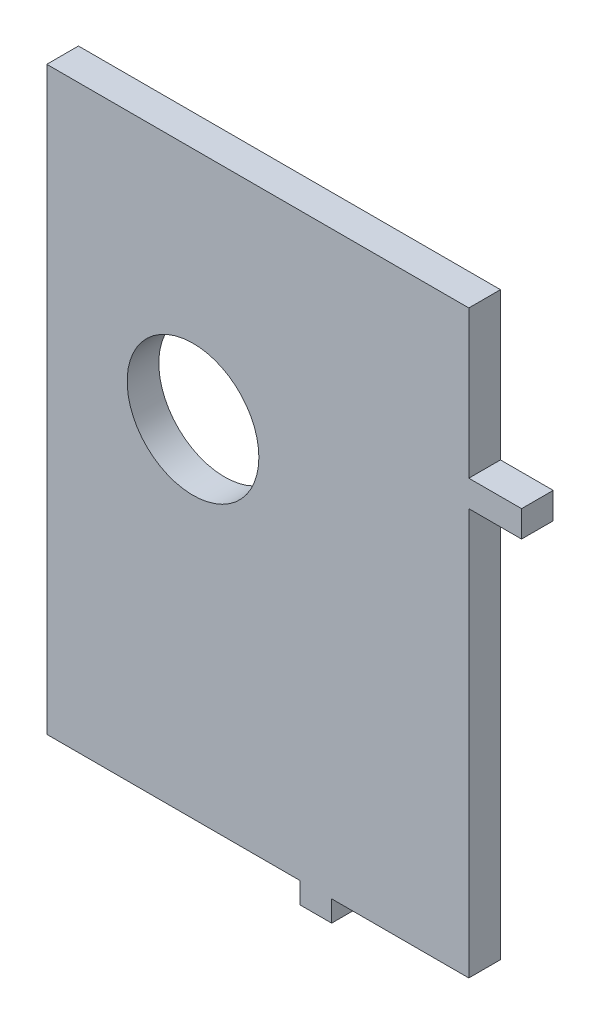
ISO-10303-21;
HEADER;
FILE_DESCRIPTION(('STEP AP214'),'2;1');
FILE_NAME('part.step','',(''),(''),'','','');
FILE_SCHEMA(('AUTOMOTIVE_DESIGN { 1 0 10303 214 1 1 1 1 }'));
ENDSEC;
DATA;
#1=APPLICATION_CONTEXT('core data for automotive mechanical design processes');
#2=APPLICATION_PROTOCOL_DEFINITION('international standard','automotive_design',2000,#1);
#3=PRODUCT_CONTEXT('',#1,'mechanical');
#4=PRODUCT('Part','Part','',(#3));
#5=PRODUCT_RELATED_PRODUCT_CATEGORY('part','',(#4));
#6=PRODUCT_DEFINITION_FORMATION('','',#4);
#7=PRODUCT_DEFINITION_CONTEXT('part definition',#1,'design');
#8=PRODUCT_DEFINITION('design','',#6,#7);
#9=PRODUCT_DEFINITION_SHAPE('','',#8);
#10=(LENGTH_UNIT() NAMED_UNIT(*) SI_UNIT(.MILLI.,.METRE.));
#11=(NAMED_UNIT(*) PLANE_ANGLE_UNIT() SI_UNIT($,.RADIAN.));
#12=(NAMED_UNIT(*) SI_UNIT($,.STERADIAN.) SOLID_ANGLE_UNIT());
#13=UNCERTAINTY_MEASURE_WITH_UNIT(LENGTH_MEASURE(1.E-05),#10,'distance_accuracy_value','');
#14=(GEOMETRIC_REPRESENTATION_CONTEXT(3) GLOBAL_UNCERTAINTY_ASSIGNED_CONTEXT((#13)) GLOBAL_UNIT_ASSIGNED_CONTEXT((#10,
#11,#12)) REPRESENTATION_CONTEXT('',''));
#15=CARTESIAN_POINT('',(0.,0.,0.));
#16=DIRECTION('',(0.,0.,1.));
#17=DIRECTION('',(1.,0.,0.));
#18=AXIS2_PLACEMENT_3D('',#15,#16,#17);
#19=CARTESIAN_POINT('',(80.,0.,6.));
#20=DIRECTION('',(-1.,0.,0.));
#21=DIRECTION('',(0.,-1.,0.));
#22=AXIS2_PLACEMENT_3D('',#19,#20,#21);
#23=PLANE('',#22);
#24=DIRECTION('',(0.,0.,1.));
#25=VECTOR('',#24,1.);
#26=CARTESIAN_POINT('',(80.,82.05,0.));
#27=LINE('',#26,#25);
#28=CARTESIAN_POINT('',(80.,82.05,0.));
#29=VERTEX_POINT('',#28);
#30=CARTESIAN_POINT('',(80.,82.05,6.));
#31=VERTEX_POINT('',#30);
#32=EDGE_CURVE('E263',#29,#31,#27,.T.);
#33=ORIENTED_EDGE('',*,*,#32,.F.);
#34=DIRECTION('',(0.,1.,0.));
#35=VECTOR('',#34,1.);
#36=CARTESIAN_POINT('',(80.,0.,0.));
#37=LINE('',#36,#35);
#38=CARTESIAN_POINT('',(80.,110.,0.));
#39=VERTEX_POINT('',#38);
#40=EDGE_CURVE('E149',#29,#39,#37,.T.);
#41=ORIENTED_EDGE('',*,*,#40,.T.);
#42=DIRECTION('',(0.,0.,-1.));
#43=VECTOR('',#42,1.);
#44=CARTESIAN_POINT('',(80.,110.,6.));
#45=LINE('',#44,#43);
#46=CARTESIAN_POINT('',(80.,110.,6.));
#47=VERTEX_POINT('',#46);
#48=EDGE_CURVE('E169',#47,#39,#45,.T.);
#49=ORIENTED_EDGE('',*,*,#48,.F.);
#50=DIRECTION('',(0.,1.,0.));
#51=VECTOR('',#50,1.);
#52=CARTESIAN_POINT('',(80.,0.,6.));
#53=LINE('',#52,#51);
#54=EDGE_CURVE('E183',#31,#47,#53,.T.);
#55=ORIENTED_EDGE('',*,*,#54,.F.);
#56=EDGE_LOOP('',(#33,#41,#49,#55));
#57=FACE_BOUND('',#56,.T.);
#58=ADVANCED_FACE('F33',(#57),#23,.F.);
#59=CARTESIAN_POINT('',(0.,0.,6.));
#60=DIRECTION('',(0.,1.,0.));
#61=DIRECTION('',(0.,0.,1.));
#62=AXIS2_PLACEMENT_3D('',#59,#60,#61);
#63=PLANE('',#62);
#64=DIRECTION('',(0.,0.,1.));
#65=VECTOR('',#64,1.);
#66=CARTESIAN_POINT('',(54.,0.,0.));
#67=LINE('',#66,#65);
#68=CARTESIAN_POINT('',(54.,0.,0.));
#69=VERTEX_POINT('',#68);
#70=CARTESIAN_POINT('',(54.,0.,6.));
#71=VERTEX_POINT('',#70);
#72=EDGE_CURVE('E225',#69,#71,#67,.T.);
#73=ORIENTED_EDGE('',*,*,#72,.F.);
#74=DIRECTION('',(1.,0.,0.));
#75=VECTOR('',#74,1.);
#76=CARTESIAN_POINT('',(0.,0.,0.));
#77=LINE('',#76,#75);
#78=CARTESIAN_POINT('',(80.,0.,0.));
#79=VERTEX_POINT('',#78);
#80=EDGE_CURVE('E176',#69,#79,#77,.T.);
#81=ORIENTED_EDGE('',*,*,#80,.T.);
#82=DIRECTION('',(0.,0.,-1.));
#83=VECTOR('',#82,1.);
#84=CARTESIAN_POINT('',(80.,0.,6.));
#85=LINE('',#84,#83);
#86=CARTESIAN_POINT('',(80.,0.,6.));
#87=VERTEX_POINT('',#86);
#88=EDGE_CURVE('E42',#87,#79,#85,.T.);
#89=ORIENTED_EDGE('',*,*,#88,.F.);
#90=DIRECTION('',(1.,0.,0.));
#91=VECTOR('',#90,1.);
#92=CARTESIAN_POINT('',(0.,0.,6.));
#93=LINE('',#92,#91);
#94=EDGE_CURVE('E184',#71,#87,#93,.T.);
#95=ORIENTED_EDGE('',*,*,#94,.F.);
#96=EDGE_LOOP('',(#73,#81,#89,#95));
#97=FACE_BOUND('',#96,.T.);
#98=ADVANCED_FACE('F224',(#97),#63,.F.);
#99=CARTESIAN_POINT('',(0.,0.,6.));
#100=DIRECTION('',(1.,0.,0.));
#101=DIRECTION('',(0.,0.,-1.));
#102=AXIS2_PLACEMENT_3D('',#99,#100,#101);
#103=PLANE('',#102);
#104=DIRECTION('',(0.,-1.,0.));
#105=VECTOR('',#104,1.);
#106=CARTESIAN_POINT('',(0.,0.,0.));
#107=LINE('',#106,#105);
#108=CARTESIAN_POINT('',(0.,110.,0.));
#109=VERTEX_POINT('',#108);
#110=CARTESIAN_POINT('',(0.,0.,0.));
#111=VERTEX_POINT('',#110);
#112=EDGE_CURVE('E178',#109,#111,#107,.T.);
#113=ORIENTED_EDGE('',*,*,#112,.T.);
#114=DIRECTION('',(0.,0.,-1.));
#115=VECTOR('',#114,1.);
#116=CARTESIAN_POINT('',(0.,0.,6.));
#117=LINE('',#116,#115);
#118=CARTESIAN_POINT('',(0.,0.,6.));
#119=VERTEX_POINT('',#118);
#120=EDGE_CURVE('E11',#119,#111,#117,.T.);
#121=ORIENTED_EDGE('',*,*,#120,.F.);
#122=DIRECTION('',(0.,-1.,0.));
#123=VECTOR('',#122,1.);
#124=CARTESIAN_POINT('',(0.,0.,6.));
#125=LINE('',#124,#123);
#126=CARTESIAN_POINT('',(0.,110.,6.));
#127=VERTEX_POINT('',#126);
#128=EDGE_CURVE('E151',#127,#119,#125,.T.);
#129=ORIENTED_EDGE('',*,*,#128,.F.);
#130=DIRECTION('',(0.,0.,-1.));
#131=VECTOR('',#130,1.);
#132=CARTESIAN_POINT('',(0.,110.,6.));
#133=LINE('',#132,#131);
#134=EDGE_CURVE('E166',#127,#109,#133,.T.);
#135=ORIENTED_EDGE('',*,*,#134,.T.);
#136=EDGE_LOOP('',(#113,#121,#129,#135));
#137=FACE_BOUND('',#136,.T.);
#138=ADVANCED_FACE('F35',(#137),#103,.F.);
#139=CARTESIAN_POINT('',(48.,0.,0.));
#140=VERTEX_POINT('',#139);
#141=EDGE_CURVE('E153',#111,#140,#77,.T.);
#142=ORIENTED_EDGE('',*,*,#141,.T.);
#143=DIRECTION('',(0.,0.,1.));
#144=VECTOR('',#143,1.);
#145=CARTESIAN_POINT('',(48.,0.,0.));
#146=LINE('',#145,#144);
#147=CARTESIAN_POINT('',(48.,0.,6.));
#148=VERTEX_POINT('',#147);
#149=EDGE_CURVE('E254',#140,#148,#146,.T.);
#150=ORIENTED_EDGE('',*,*,#149,.T.);
#151=EDGE_CURVE('E179',#119,#148,#93,.T.);
#152=ORIENTED_EDGE('',*,*,#151,.F.);
#153=ORIENTED_EDGE('',*,*,#120,.T.);
#154=EDGE_LOOP('',(#142,#150,#152,#153));
#155=FACE_BOUND('',#154,.T.);
#156=ADVANCED_FACE('F292',(#155),#63,.F.);
#157=CARTESIAN_POINT('',(80.,77.05,0.));
#158=VERTEX_POINT('',#157);
#159=EDGE_CURVE('E139',#79,#158,#37,.T.);
#160=ORIENTED_EDGE('',*,*,#159,.T.);
#161=DIRECTION('',(0.,0.,1.));
#162=VECTOR('',#161,1.);
#163=CARTESIAN_POINT('',(80.,77.05,0.));
#164=LINE('',#163,#162);
#165=CARTESIAN_POINT('',(80.,77.05,6.));
#166=VERTEX_POINT('',#165);
#167=EDGE_CURVE('E122',#158,#166,#164,.T.);
#168=ORIENTED_EDGE('',*,*,#167,.T.);
#169=EDGE_CURVE('E196',#87,#166,#53,.T.);
#170=ORIENTED_EDGE('',*,*,#169,.F.);
#171=ORIENTED_EDGE('',*,*,#88,.T.);
#172=EDGE_LOOP('',(#160,#168,#170,#171));
#173=FACE_BOUND('',#172,.T.);
#174=ADVANCED_FACE('F146',(#173),#23,.F.);
#175=CARTESIAN_POINT('',(0.,110.,6.));
#176=DIRECTION('',(0.,-1.,0.));
#177=DIRECTION('',(0.,0.,-1.));
#178=AXIS2_PLACEMENT_3D('',#175,#176,#177);
#179=PLANE('',#178);
#180=DIRECTION('',(-1.,0.,0.));
#181=VECTOR('',#180,1.);
#182=CARTESIAN_POINT('',(0.,110.,0.));
#183=LINE('',#182,#181);
#184=EDGE_CURVE('E148',#39,#109,#183,.T.);
#185=ORIENTED_EDGE('',*,*,#184,.T.);
#186=ORIENTED_EDGE('',*,*,#134,.F.);
#187=DIRECTION('',(-1.,0.,0.));
#188=VECTOR('',#187,1.);
#189=CARTESIAN_POINT('',(0.,110.,6.));
#190=LINE('',#189,#188);
#191=EDGE_CURVE('E170',#47,#127,#190,.T.);
#192=ORIENTED_EDGE('',*,*,#191,.F.);
#193=ORIENTED_EDGE('',*,*,#48,.T.);
#194=EDGE_LOOP('',(#185,#186,#192,#193));
#195=FACE_BOUND('',#194,.T.);
#196=ADVANCED_FACE('F212',(#195),#179,.F.);
#197=CARTESIAN_POINT('',(0.,0.,6.));
#198=DIRECTION('',(0.,0.,-1.));
#199=DIRECTION('',(-1.,0.,0.));
#200=AXIS2_PLACEMENT_3D('',#197,#198,#199);
#201=PLANE('',#200);
#202=CARTESIAN_POINT('',(27.72,65.58,6.));
#203=DIRECTION('',(0.,0.,1.));
#204=DIRECTION('',(1.,0.,0.));
#205=AXIS2_PLACEMENT_3D('',#202,#203,#204);
#206=CIRCLE('',#205,12.4841);
#207=CARTESIAN_POINT('',(40.2041,65.58,6.));
#208=VERTEX_POINT('',#207);
#209=EDGE_CURVE('E282',#208,#208,#206,.T.);
#210=ORIENTED_EDGE('',*,*,#209,.F.);
#211=EDGE_LOOP('',(#210));
#212=FACE_BOUND('',#211,.T.);
#213=ORIENTED_EDGE('',*,*,#128,.T.);
#214=ORIENTED_EDGE('',*,*,#151,.T.);
#215=DIRECTION('',(0.,-1.,0.));
#216=VECTOR('',#215,1.);
#217=CARTESIAN_POINT('',(48.,0.,6.));
#218=LINE('',#217,#216);
#219=CARTESIAN_POINT('',(48.,-4.,6.));
#220=VERTEX_POINT('',#219);
#221=EDGE_CURVE('E58',#148,#220,#218,.T.);
#222=ORIENTED_EDGE('',*,*,#221,.T.);
#223=DIRECTION('',(1.,0.,0.));
#224=VECTOR('',#223,1.);
#225=CARTESIAN_POINT('',(48.,-4.,6.));
#226=LINE('',#225,#224);
#227=CARTESIAN_POINT('',(54.,-4.,6.));
#228=VERTEX_POINT('',#227);
#229=EDGE_CURVE('E247',#220,#228,#226,.T.);
#230=ORIENTED_EDGE('',*,*,#229,.T.);
#231=DIRECTION('',(0.,1.,0.));
#232=VECTOR('',#231,1.);
#233=CARTESIAN_POINT('',(54.,0.,6.));
#234=LINE('',#233,#232);
#235=EDGE_CURVE('E221',#228,#71,#234,.T.);
#236=ORIENTED_EDGE('',*,*,#235,.T.);
#237=ORIENTED_EDGE('',*,*,#94,.T.);
#238=ORIENTED_EDGE('',*,*,#169,.T.);
#239=DIRECTION('',(1.,0.,0.));
#240=VECTOR('',#239,1.);
#241=CARTESIAN_POINT('',(80.,77.05,6.));
#242=LINE('',#241,#240);
#243=CARTESIAN_POINT('',(90.,77.05,6.));
#244=VERTEX_POINT('',#243);
#245=EDGE_CURVE('E50',#166,#244,#242,.T.);
#246=ORIENTED_EDGE('',*,*,#245,.T.);
#247=DIRECTION('',(0.,1.,0.));
#248=VECTOR('',#247,1.);
#249=CARTESIAN_POINT('',(90.,82.05,6.));
#250=LINE('',#249,#248);
#251=CARTESIAN_POINT('',(90.,82.05,6.));
#252=VERTEX_POINT('',#251);
#253=EDGE_CURVE('E275',#244,#252,#250,.T.);
#254=ORIENTED_EDGE('',*,*,#253,.T.);
#255=DIRECTION('',(-1.,0.,0.));
#256=VECTOR('',#255,1.);
#257=CARTESIAN_POINT('',(80.,82.05,6.));
#258=LINE('',#257,#256);
#259=EDGE_CURVE('E143',#252,#31,#258,.T.);
#260=ORIENTED_EDGE('',*,*,#259,.T.);
#261=ORIENTED_EDGE('',*,*,#54,.T.);
#262=ORIENTED_EDGE('',*,*,#191,.T.);
#263=EDGE_LOOP('',(#213,#214,#222,#230,#236,#237,#238,#246,#254,#260,#261,#262));
#264=FACE_BOUND('',#263,.T.);
#265=ADVANCED_FACE('F202',(#212,#264),#201,.F.);
#266=CARTESIAN_POINT('',(0.,0.,0.));
#267=DIRECTION('',(0.,0.,-1.));
#268=DIRECTION('',(-1.,0.,0.));
#269=AXIS2_PLACEMENT_3D('',#266,#267,#268);
#270=PLANE('',#269);
#271=CARTESIAN_POINT('',(27.72,65.58,0.));
#272=DIRECTION('',(0.,0.,1.));
#273=DIRECTION('',(1.,0.,0.));
#274=AXIS2_PLACEMENT_3D('',#271,#272,#273);
#275=CIRCLE('',#274,12.4841);
#276=CARTESIAN_POINT('',(40.2041,65.58,0.));
#277=VERTEX_POINT('',#276);
#278=EDGE_CURVE('E280',#277,#277,#275,.T.);
#279=ORIENTED_EDGE('',*,*,#278,.T.);
#280=EDGE_LOOP('',(#279));
#281=FACE_BOUND('',#280,.T.);
#282=ORIENTED_EDGE('',*,*,#112,.F.);
#283=ORIENTED_EDGE('',*,*,#184,.F.);
#284=ORIENTED_EDGE('',*,*,#40,.F.);
#285=DIRECTION('',(-1.,0.,0.));
#286=VECTOR('',#285,1.);
#287=CARTESIAN_POINT('',(80.,82.05,0.));
#288=LINE('',#287,#286);
#289=CARTESIAN_POINT('',(90.,82.05,0.));
#290=VERTEX_POINT('',#289);
#291=EDGE_CURVE('E131',#290,#29,#288,.T.);
#292=ORIENTED_EDGE('',*,*,#291,.F.);
#293=DIRECTION('',(0.,1.,0.));
#294=VECTOR('',#293,1.);
#295=CARTESIAN_POINT('',(90.,82.05,0.));
#296=LINE('',#295,#294);
#297=CARTESIAN_POINT('',(90.,77.05,0.));
#298=VERTEX_POINT('',#297);
#299=EDGE_CURVE('E142',#298,#290,#296,.T.);
#300=ORIENTED_EDGE('',*,*,#299,.F.);
#301=DIRECTION('',(1.,0.,0.));
#302=VECTOR('',#301,1.);
#303=CARTESIAN_POINT('',(80.,77.05,0.));
#304=LINE('',#303,#302);
#305=EDGE_CURVE('E125',#158,#298,#304,.T.);
#306=ORIENTED_EDGE('',*,*,#305,.F.);
#307=ORIENTED_EDGE('',*,*,#159,.F.);
#308=ORIENTED_EDGE('',*,*,#80,.F.);
#309=DIRECTION('',(0.,1.,0.));
#310=VECTOR('',#309,1.);
#311=CARTESIAN_POINT('',(54.,0.,0.));
#312=LINE('',#311,#310);
#313=CARTESIAN_POINT('',(54.,-4.,0.));
#314=VERTEX_POINT('',#313);
#315=EDGE_CURVE('E228',#314,#69,#312,.T.);
#316=ORIENTED_EDGE('',*,*,#315,.F.);
#317=DIRECTION('',(1.,0.,0.));
#318=VECTOR('',#317,1.);
#319=CARTESIAN_POINT('',(48.,-4.,0.));
#320=LINE('',#319,#318);
#321=CARTESIAN_POINT('',(48.,-4.,0.));
#322=VERTEX_POINT('',#321);
#323=EDGE_CURVE('E231',#322,#314,#320,.T.);
#324=ORIENTED_EDGE('',*,*,#323,.F.);
#325=DIRECTION('',(0.,-1.,0.));
#326=VECTOR('',#325,1.);
#327=CARTESIAN_POINT('',(48.,0.,0.));
#328=LINE('',#327,#326);
#329=EDGE_CURVE('E240',#140,#322,#328,.T.);
#330=ORIENTED_EDGE('',*,*,#329,.F.);
#331=ORIENTED_EDGE('',*,*,#141,.F.);
#332=EDGE_LOOP('',(#282,#283,#284,#292,#300,#306,#307,#308,#316,#324,#330,#331));
#333=FACE_BOUND('',#332,.T.);
#334=ADVANCED_FACE('F137',(#281,#333),#270,.T.);
#335=CARTESIAN_POINT('',(48.,0.,0.));
#336=DIRECTION('',(-1.,0.,0.));
#337=DIRECTION('',(0.,0.,1.));
#338=AXIS2_PLACEMENT_3D('',#335,#336,#337);
#339=PLANE('',#338);
#340=ORIENTED_EDGE('',*,*,#221,.F.);
#341=ORIENTED_EDGE('',*,*,#149,.F.);
#342=ORIENTED_EDGE('',*,*,#329,.T.);
#343=DIRECTION('',(0.,0.,1.));
#344=VECTOR('',#343,1.);
#345=CARTESIAN_POINT('',(48.,-4.,0.));
#346=LINE('',#345,#344);
#347=EDGE_CURVE('E234',#322,#220,#346,.T.);
#348=ORIENTED_EDGE('',*,*,#347,.T.);
#349=EDGE_LOOP('',(#340,#341,#342,#348));
#350=FACE_BOUND('',#349,.T.);
#351=ADVANCED_FACE('F262',(#350),#339,.T.);
#352=CARTESIAN_POINT('',(54.,0.,0.));
#353=DIRECTION('',(1.,0.,0.));
#354=DIRECTION('',(0.,0.,-1.));
#355=AXIS2_PLACEMENT_3D('',#352,#353,#354);
#356=PLANE('',#355);
#357=ORIENTED_EDGE('',*,*,#235,.F.);
#358=DIRECTION('',(0.,0.,1.));
#359=VECTOR('',#358,1.);
#360=CARTESIAN_POINT('',(54.,-4.,0.));
#361=LINE('',#360,#359);
#362=EDGE_CURVE('E239',#314,#228,#361,.T.);
#363=ORIENTED_EDGE('',*,*,#362,.F.);
#364=ORIENTED_EDGE('',*,*,#315,.T.);
#365=ORIENTED_EDGE('',*,*,#72,.T.);
#366=EDGE_LOOP('',(#357,#363,#364,#365));
#367=FACE_BOUND('',#366,.T.);
#368=ADVANCED_FACE('F313',(#367),#356,.T.);
#369=CARTESIAN_POINT('',(48.,-4.,0.));
#370=DIRECTION('',(0.,-1.,0.));
#371=DIRECTION('',(0.,0.,-1.));
#372=AXIS2_PLACEMENT_3D('',#369,#370,#371);
#373=PLANE('',#372);
#374=ORIENTED_EDGE('',*,*,#229,.F.);
#375=ORIENTED_EDGE('',*,*,#347,.F.);
#376=ORIENTED_EDGE('',*,*,#323,.T.);
#377=ORIENTED_EDGE('',*,*,#362,.T.);
#378=EDGE_LOOP('',(#374,#375,#376,#377));
#379=FACE_BOUND('',#378,.T.);
#380=ADVANCED_FACE('F238',(#379),#373,.T.);
#381=CARTESIAN_POINT('',(80.,82.05,0.));
#382=DIRECTION('',(0.,1.,0.));
#383=DIRECTION('',(0.,0.,1.));
#384=AXIS2_PLACEMENT_3D('',#381,#382,#383);
#385=PLANE('',#384);
#386=ORIENTED_EDGE('',*,*,#259,.F.);
#387=DIRECTION('',(0.,0.,1.));
#388=VECTOR('',#387,1.);
#389=CARTESIAN_POINT('',(90.,82.05,0.));
#390=LINE('',#389,#388);
#391=EDGE_CURVE('E264',#290,#252,#390,.T.);
#392=ORIENTED_EDGE('',*,*,#391,.F.);
#393=ORIENTED_EDGE('',*,*,#291,.T.);
#394=ORIENTED_EDGE('',*,*,#32,.T.);
#395=EDGE_LOOP('',(#386,#392,#393,#394));
#396=FACE_BOUND('',#395,.T.);
#397=ADVANCED_FACE('F290',(#396),#385,.T.);
#398=CARTESIAN_POINT('',(90.,82.05,0.));
#399=DIRECTION('',(1.,0.,0.));
#400=DIRECTION('',(0.,0.,-1.));
#401=AXIS2_PLACEMENT_3D('',#398,#399,#400);
#402=PLANE('',#401);
#403=ORIENTED_EDGE('',*,*,#253,.F.);
#404=DIRECTION('',(0.,0.,1.));
#405=VECTOR('',#404,1.);
#406=CARTESIAN_POINT('',(90.,77.05,0.));
#407=LINE('',#406,#405);
#408=EDGE_CURVE('E130',#298,#244,#407,.T.);
#409=ORIENTED_EDGE('',*,*,#408,.F.);
#410=ORIENTED_EDGE('',*,*,#299,.T.);
#411=ORIENTED_EDGE('',*,*,#391,.T.);
#412=EDGE_LOOP('',(#403,#409,#410,#411));
#413=FACE_BOUND('',#412,.T.);
#414=ADVANCED_FACE('F279',(#413),#402,.T.);
#415=CARTESIAN_POINT('',(80.,77.05,0.));
#416=DIRECTION('',(0.,-1.,0.));
#417=DIRECTION('',(0.,0.,-1.));
#418=AXIS2_PLACEMENT_3D('',#415,#416,#417);
#419=PLANE('',#418);
#420=ORIENTED_EDGE('',*,*,#245,.F.);
#421=ORIENTED_EDGE('',*,*,#167,.F.);
#422=ORIENTED_EDGE('',*,*,#305,.T.);
#423=ORIENTED_EDGE('',*,*,#408,.T.);
#424=EDGE_LOOP('',(#420,#421,#422,#423));
#425=FACE_BOUND('',#424,.T.);
#426=ADVANCED_FACE('F124',(#425),#419,.T.);
#427=CARTESIAN_POINT('',(27.72,65.58,0.));
#428=DIRECTION('',(0.,0.,1.));
#429=DIRECTION('',(1.,0.,0.));
#430=AXIS2_PLACEMENT_3D('',#427,#428,#429);
#431=CYLINDRICAL_SURFACE('',#430,12.4841);
#432=ORIENTED_EDGE('',*,*,#278,.F.);
#433=EDGE_LOOP('',(#432));
#434=FACE_BOUND('',#433,.T.);
#435=ORIENTED_EDGE('',*,*,#209,.T.);
#436=EDGE_LOOP('',(#435));
#437=FACE_BOUND('',#436,.T.);
#438=ADVANCED_FACE('F320',(#434,#437),#431,.F.);
#439=CLOSED_SHELL('',(#58,#98,#138,#156,#174,#196,#265,#334,#351,#368,#380,#397,#414,#426,#438));
#440=MANIFOLD_SOLID_BREP('B2',#439);
#441=ADVANCED_BREP_SHAPE_REPRESENTATION('',(#18,#440),#14);
#442=SHAPE_DEFINITION_REPRESENTATION(#9,#441);
ENDSEC;
END-ISO-10303-21;
